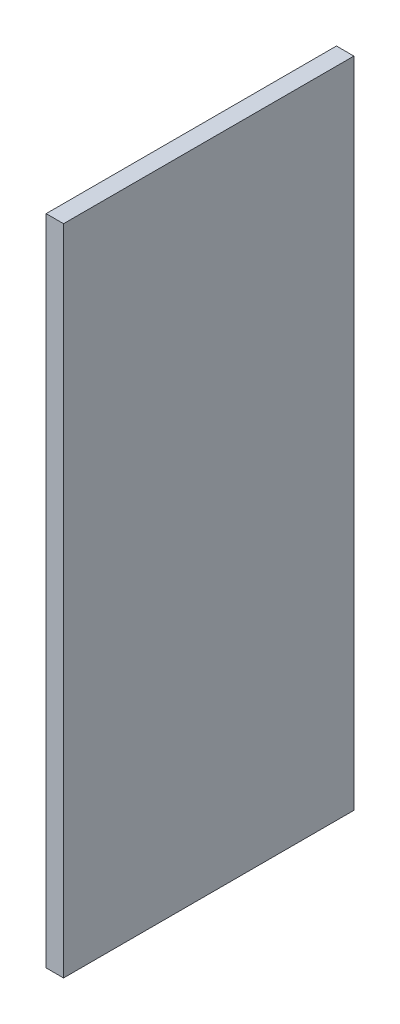
ISO-10303-21;
HEADER;
FILE_DESCRIPTION(('STEP AP214'),'2;1');
FILE_NAME('part.step','',(''),(''),'','','');
FILE_SCHEMA(('AUTOMOTIVE_DESIGN { 1 0 10303 214 1 1 1 1 }'));
ENDSEC;
DATA;
#1=APPLICATION_CONTEXT('core data for automotive mechanical design processes');
#2=APPLICATION_PROTOCOL_DEFINITION('international standard','automotive_design',2000,#1);
#3=PRODUCT_CONTEXT('',#1,'mechanical');
#4=PRODUCT('Part','Part','',(#3));
#5=PRODUCT_RELATED_PRODUCT_CATEGORY('part','',(#4));
#6=PRODUCT_DEFINITION_FORMATION('','',#4);
#7=PRODUCT_DEFINITION_CONTEXT('part definition',#1,'design');
#8=PRODUCT_DEFINITION('design','',#6,#7);
#9=PRODUCT_DEFINITION_SHAPE('','',#8);
#10=(LENGTH_UNIT() NAMED_UNIT(*) SI_UNIT(.MILLI.,.METRE.));
#11=(NAMED_UNIT(*) PLANE_ANGLE_UNIT() SI_UNIT($,.RADIAN.));
#12=(NAMED_UNIT(*) SI_UNIT($,.STERADIAN.) SOLID_ANGLE_UNIT());
#13=UNCERTAINTY_MEASURE_WITH_UNIT(LENGTH_MEASURE(1.E-05),#10,'distance_accuracy_value','');
#14=(GEOMETRIC_REPRESENTATION_CONTEXT(3) GLOBAL_UNCERTAINTY_ASSIGNED_CONTEXT((#13)) GLOBAL_UNIT_ASSIGNED_CONTEXT((#10,
#11,#12)) REPRESENTATION_CONTEXT('',''));
#15=CARTESIAN_POINT('',(0.,0.,0.));
#16=DIRECTION('',(0.,0.,1.));
#17=DIRECTION('',(1.,0.,0.));
#18=AXIS2_PLACEMENT_3D('',#15,#16,#17);
#19=CARTESIAN_POINT('',(0.,0.,-12.7));
#20=DIRECTION('',(0.,0.,-1.));
#21=DIRECTION('',(0.,1.,0.));
#22=AXIS2_PLACEMENT_3D('',#19,#20,#21);
#23=PLANE('',#22);
#24=DIRECTION('',(1.,0.,0.));
#25=VECTOR('',#24,1.);
#26=CARTESIAN_POINT('',(0.,0.,-12.7));
#27=LINE('',#26,#25);
#28=CARTESIAN_POINT('',(-0.762,0.,-12.7));
#29=VERTEX_POINT('',#28);
#30=CARTESIAN_POINT('',(0.762,0.,-12.7));
#31=VERTEX_POINT('',#30);
#32=EDGE_CURVE('E11',#29,#31,#27,.T.);
#33=ORIENTED_EDGE('',*,*,#32,.F.);
#34=DIRECTION('',(0.,1.,0.));
#35=VECTOR('',#34,1.);
#36=CARTESIAN_POINT('',(-0.762,0.,-12.7));
#37=LINE('',#36,#35);
#38=CARTESIAN_POINT('',(-0.762,57.15,-12.7));
#39=VERTEX_POINT('',#38);
#40=EDGE_CURVE('E76',#29,#39,#37,.T.);
#41=ORIENTED_EDGE('',*,*,#40,.T.);
#42=DIRECTION('',(1.,0.,0.));
#43=VECTOR('',#42,1.);
#44=CARTESIAN_POINT('',(0.,57.15,-12.7));
#45=LINE('',#44,#43);
#46=CARTESIAN_POINT('',(0.762,57.15,-12.7));
#47=VERTEX_POINT('',#46);
#48=EDGE_CURVE('E53',#39,#47,#45,.T.);
#49=ORIENTED_EDGE('',*,*,#48,.T.);
#50=DIRECTION('',(0.,1.,0.));
#51=VECTOR('',#50,1.);
#52=CARTESIAN_POINT('',(0.762,0.,-12.7));
#53=LINE('',#52,#51);
#54=EDGE_CURVE('E78',#31,#47,#53,.T.);
#55=ORIENTED_EDGE('',*,*,#54,.F.);
#56=EDGE_LOOP('',(#33,#41,#49,#55));
#57=FACE_BOUND('',#56,.T.);
#58=ADVANCED_FACE('F43',(#57),#23,.T.);
#59=CARTESIAN_POINT('',(0.,57.15,-12.7));
#60=DIRECTION('',(0.,1.,0.));
#61=DIRECTION('',(0.,0.,1.));
#62=AXIS2_PLACEMENT_3D('',#59,#60,#61);
#63=PLANE('',#62);
#64=ORIENTED_EDGE('',*,*,#48,.F.);
#65=DIRECTION('',(0.,0.,-1.));
#66=VECTOR('',#65,1.);
#67=CARTESIAN_POINT('',(-0.762,57.15,-12.7));
#68=LINE('',#67,#66);
#69=CARTESIAN_POINT('',(-0.762,57.15,12.7));
#70=VERTEX_POINT('',#69);
#71=EDGE_CURVE('E90',#39,#70,#68,.F.);
#72=ORIENTED_EDGE('',*,*,#71,.T.);
#73=DIRECTION('',(1.,0.,0.));
#74=VECTOR('',#73,1.);
#75=CARTESIAN_POINT('',(0.,57.15,12.7));
#76=LINE('',#75,#74);
#77=CARTESIAN_POINT('',(0.762,57.15,12.7));
#78=VERTEX_POINT('',#77);
#79=EDGE_CURVE('E98',#70,#78,#76,.T.);
#80=ORIENTED_EDGE('',*,*,#79,.T.);
#81=DIRECTION('',(0.,0.,-1.));
#82=VECTOR('',#81,1.);
#83=CARTESIAN_POINT('',(0.762,57.15,-12.7));
#84=LINE('',#83,#82);
#85=EDGE_CURVE('E104',#47,#78,#84,.F.);
#86=ORIENTED_EDGE('',*,*,#85,.F.);
#87=EDGE_LOOP('',(#64,#72,#80,#86));
#88=FACE_BOUND('',#87,.T.);
#89=ADVANCED_FACE('F117',(#88),#63,.T.);
#90=CARTESIAN_POINT('',(0.,0.,12.7));
#91=DIRECTION('',(0.,0.,-1.));
#92=DIRECTION('',(0.,1.,0.));
#93=AXIS2_PLACEMENT_3D('',#90,#91,#92);
#94=PLANE('',#93);
#95=ORIENTED_EDGE('',*,*,#79,.F.);
#96=DIRECTION('',(0.,1.,0.));
#97=VECTOR('',#96,1.);
#98=CARTESIAN_POINT('',(-0.762,0.,12.7));
#99=LINE('',#98,#97);
#100=CARTESIAN_POINT('',(-0.762,0.,12.7));
#101=VERTEX_POINT('',#100);
#102=EDGE_CURVE('E93',#101,#70,#99,.T.);
#103=ORIENTED_EDGE('',*,*,#102,.F.);
#104=DIRECTION('',(1.,0.,0.));
#105=VECTOR('',#104,1.);
#106=CARTESIAN_POINT('',(0.,0.,12.7));
#107=LINE('',#106,#105);
#108=CARTESIAN_POINT('',(0.762,0.,12.7));
#109=VERTEX_POINT('',#108);
#110=EDGE_CURVE('E47',#101,#109,#107,.T.);
#111=ORIENTED_EDGE('',*,*,#110,.T.);
#112=DIRECTION('',(0.,1.,0.));
#113=VECTOR('',#112,1.);
#114=CARTESIAN_POINT('',(0.762,0.,12.7));
#115=LINE('',#114,#113);
#116=EDGE_CURVE('E113',#109,#78,#115,.T.);
#117=ORIENTED_EDGE('',*,*,#116,.T.);
#118=EDGE_LOOP('',(#95,#103,#111,#117));
#119=FACE_BOUND('',#118,.T.);
#120=ADVANCED_FACE('F115',(#119),#94,.F.);
#121=CARTESIAN_POINT('',(0.,0.,-12.7));
#122=DIRECTION('',(0.,1.,0.));
#123=DIRECTION('',(0.,0.,1.));
#124=AXIS2_PLACEMENT_3D('',#121,#122,#123);
#125=PLANE('',#124);
#126=DIRECTION('',(0.,0.,-1.));
#127=VECTOR('',#126,1.);
#128=CARTESIAN_POINT('',(-0.762,0.,-12.7));
#129=LINE('',#128,#127);
#130=EDGE_CURVE('E87',#29,#101,#129,.F.);
#131=ORIENTED_EDGE('',*,*,#130,.F.);
#132=ORIENTED_EDGE('',*,*,#32,.T.);
#133=DIRECTION('',(0.,0.,-1.));
#134=VECTOR('',#133,1.);
#135=CARTESIAN_POINT('',(0.762,0.,-12.7));
#136=LINE('',#135,#134);
#137=EDGE_CURVE('E110',#31,#109,#136,.F.);
#138=ORIENTED_EDGE('',*,*,#137,.T.);
#139=ORIENTED_EDGE('',*,*,#110,.F.);
#140=EDGE_LOOP('',(#131,#132,#138,#139));
#141=FACE_BOUND('',#140,.T.);
#142=ADVANCED_FACE('F45',(#141),#125,.F.);
#143=CARTESIAN_POINT('',(0.762,0.,-12.7));
#144=DIRECTION('',(1.,0.,0.));
#145=DIRECTION('',(0.,0.,-1.));
#146=AXIS2_PLACEMENT_3D('',#143,#144,#145);
#147=PLANE('',#146);
#148=ORIENTED_EDGE('',*,*,#116,.F.);
#149=ORIENTED_EDGE('',*,*,#137,.F.);
#150=ORIENTED_EDGE('',*,*,#54,.T.);
#151=ORIENTED_EDGE('',*,*,#85,.T.);
#152=EDGE_LOOP('',(#148,#149,#150,#151));
#153=FACE_BOUND('',#152,.T.);
#154=ADVANCED_FACE('F116',(#153),#147,.T.);
#155=CARTESIAN_POINT('',(-0.762,0.,-12.7));
#156=DIRECTION('',(1.,0.,0.));
#157=DIRECTION('',(0.,0.,-1.));
#158=AXIS2_PLACEMENT_3D('',#155,#156,#157);
#159=PLANE('',#158);
#160=ORIENTED_EDGE('',*,*,#102,.T.);
#161=ORIENTED_EDGE('',*,*,#71,.F.);
#162=ORIENTED_EDGE('',*,*,#40,.F.);
#163=ORIENTED_EDGE('',*,*,#130,.T.);
#164=EDGE_LOOP('',(#160,#161,#162,#163));
#165=FACE_BOUND('',#164,.T.);
#166=ADVANCED_FACE('F86',(#165),#159,.F.);
#167=CLOSED_SHELL('',(#58,#89,#120,#142,#154,#166));
#168=MANIFOLD_SOLID_BREP('B2',#167);
#169=ADVANCED_BREP_SHAPE_REPRESENTATION('',(#18,#168),#14);
#170=SHAPE_DEFINITION_REPRESENTATION(#9,#169);
ENDSEC;
END-ISO-10303-21;
